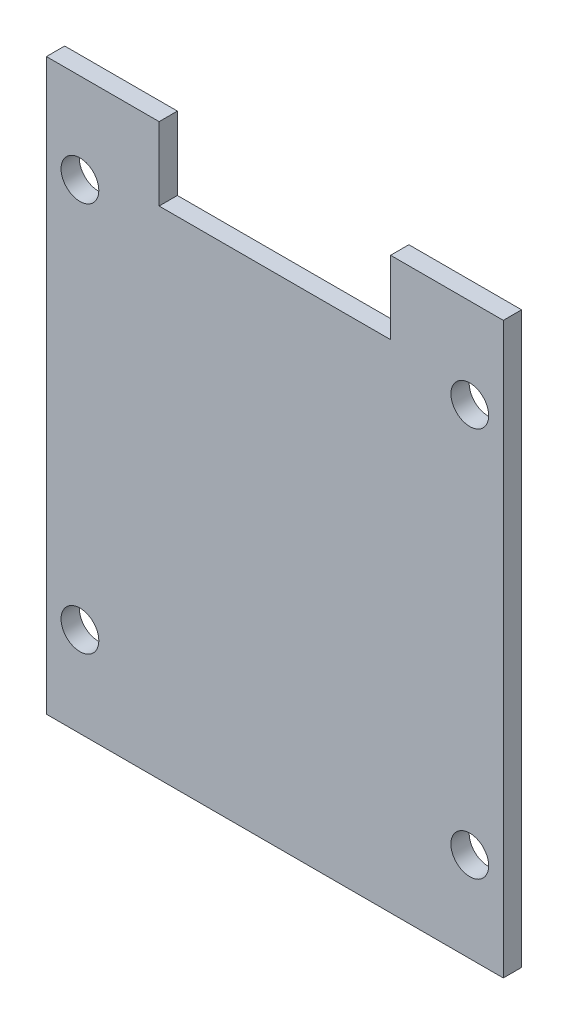
ISO-10303-21;
HEADER;
FILE_DESCRIPTION(('STEP AP214'),'2;1');
FILE_NAME('part.step','',(''),(''),'','','');
FILE_SCHEMA(('AUTOMOTIVE_DESIGN { 1 0 10303 214 1 1 1 1 }'));
ENDSEC;
DATA;
#1=APPLICATION_CONTEXT('core data for automotive mechanical design processes');
#2=APPLICATION_PROTOCOL_DEFINITION('international standard','automotive_design',2000,#1);
#3=PRODUCT_CONTEXT('',#1,'mechanical');
#4=PRODUCT('Part','Part','',(#3));
#5=PRODUCT_RELATED_PRODUCT_CATEGORY('part','',(#4));
#6=PRODUCT_DEFINITION_FORMATION('','',#4);
#7=PRODUCT_DEFINITION_CONTEXT('part definition',#1,'design');
#8=PRODUCT_DEFINITION('design','',#6,#7);
#9=PRODUCT_DEFINITION_SHAPE('','',#8);
#10=(LENGTH_UNIT() NAMED_UNIT(*) SI_UNIT(.MILLI.,.METRE.));
#11=(NAMED_UNIT(*) PLANE_ANGLE_UNIT() SI_UNIT($,.RADIAN.));
#12=(NAMED_UNIT(*) SI_UNIT($,.STERADIAN.) SOLID_ANGLE_UNIT());
#13=UNCERTAINTY_MEASURE_WITH_UNIT(LENGTH_MEASURE(1.E-05),#10,'distance_accuracy_value','');
#14=(GEOMETRIC_REPRESENTATION_CONTEXT(3) GLOBAL_UNCERTAINTY_ASSIGNED_CONTEXT((#13)) GLOBAL_UNIT_ASSIGNED_CONTEXT((#10,
#11,#12)) REPRESENTATION_CONTEXT('',''));
#15=CARTESIAN_POINT('',(0.,0.,0.));
#16=DIRECTION('',(0.,0.,1.));
#17=DIRECTION('',(1.,0.,0.));
#18=AXIS2_PLACEMENT_3D('',#15,#16,#17);
#19=CARTESIAN_POINT('',(-37.5,46.75,3.));
#20=DIRECTION('',(0.,-1.,0.));
#21=DIRECTION('',(0.,0.,-1.));
#22=AXIS2_PLACEMENT_3D('',#19,#20,#21);
#23=PLANE('',#22);
#24=DIRECTION('',(0.,0.,1.));
#25=VECTOR('',#24,1.);
#26=CARTESIAN_POINT('',(19.,46.75,0.));
#27=LINE('',#26,#25);
#28=CARTESIAN_POINT('',(19.,46.75,0.));
#29=VERTEX_POINT('',#28);
#30=CARTESIAN_POINT('',(19.,46.75,3.));
#31=VERTEX_POINT('',#30);
#32=EDGE_CURVE('E114',#29,#31,#27,.T.);
#33=ORIENTED_EDGE('',*,*,#32,.T.);
#34=DIRECTION('',(-1.,0.,0.));
#35=VECTOR('',#34,1.);
#36=CARTESIAN_POINT('',(-37.5,46.75,3.));
#37=LINE('',#36,#35);
#38=CARTESIAN_POINT('',(37.5,46.75,3.));
#39=VERTEX_POINT('',#38);
#40=EDGE_CURVE('E86',#39,#31,#37,.T.);
#41=ORIENTED_EDGE('',*,*,#40,.F.);
#42=DIRECTION('',(0.,0.,-1.));
#43=VECTOR('',#42,1.);
#44=CARTESIAN_POINT('',(37.5,46.75,3.));
#45=LINE('',#44,#43);
#46=CARTESIAN_POINT('',(37.5,46.75,0.));
#47=VERTEX_POINT('',#46);
#48=EDGE_CURVE('E176',#39,#47,#45,.T.);
#49=ORIENTED_EDGE('',*,*,#48,.T.);
#50=DIRECTION('',(-1.,0.,0.));
#51=VECTOR('',#50,1.);
#52=CARTESIAN_POINT('',(-37.5,46.75,0.));
#53=LINE('',#52,#51);
#54=EDGE_CURVE('E165',#47,#29,#53,.T.);
#55=ORIENTED_EDGE('',*,*,#54,.T.);
#56=EDGE_LOOP('',(#33,#41,#49,#55));
#57=FACE_BOUND('',#56,.T.);
#58=ADVANCED_FACE('F33',(#57),#23,.F.);
#59=CARTESIAN_POINT('',(0.,0.,3.));
#60=DIRECTION('',(0.,0.,1.));
#61=DIRECTION('',(1.,0.,0.));
#62=AXIS2_PLACEMENT_3D('',#59,#60,#61);
#63=PLANE('',#62);
#64=CARTESIAN_POINT('',(32.,-32.,3.));
#65=DIRECTION('',(0.,0.,1.));
#66=DIRECTION('',(1.,0.,0.));
#67=AXIS2_PLACEMENT_3D('',#64,#65,#66);
#68=CIRCLE('',#67,3.1);
#69=CARTESIAN_POINT('',(35.1,-32.,3.));
#70=VERTEX_POINT('',#69);
#71=EDGE_CURVE('E11',#70,#70,#68,.T.);
#72=ORIENTED_EDGE('',*,*,#71,.F.);
#73=EDGE_LOOP('',(#72));
#74=FACE_BOUND('',#73,.T.);
#75=CARTESIAN_POINT('',(-32.,-32.,3.));
#76=DIRECTION('',(0.,0.,1.));
#77=DIRECTION('',(1.,0.,0.));
#78=AXIS2_PLACEMENT_3D('',#75,#76,#77);
#79=CIRCLE('',#78,3.1);
#80=CARTESIAN_POINT('',(-28.9,-32.,3.));
#81=VERTEX_POINT('',#80);
#82=EDGE_CURVE('E181',#81,#81,#79,.T.);
#83=ORIENTED_EDGE('',*,*,#82,.F.);
#84=EDGE_LOOP('',(#83));
#85=FACE_BOUND('',#84,.T.);
#86=CARTESIAN_POINT('',(-32.,32.,3.));
#87=DIRECTION('',(0.,0.,1.));
#88=DIRECTION('',(1.,0.,0.));
#89=AXIS2_PLACEMENT_3D('',#86,#87,#88);
#90=CIRCLE('',#89,3.1);
#91=CARTESIAN_POINT('',(-28.9,32.,3.));
#92=VERTEX_POINT('',#91);
#93=EDGE_CURVE('E147',#92,#92,#90,.T.);
#94=ORIENTED_EDGE('',*,*,#93,.F.);
#95=EDGE_LOOP('',(#94));
#96=FACE_BOUND('',#95,.T.);
#97=CARTESIAN_POINT('',(32.,32.,3.));
#98=DIRECTION('',(0.,0.,1.));
#99=DIRECTION('',(1.,0.,0.));
#100=AXIS2_PLACEMENT_3D('',#97,#98,#99);
#101=CIRCLE('',#100,3.1);
#102=CARTESIAN_POINT('',(35.1,32.,3.));
#103=VERTEX_POINT('',#102);
#104=EDGE_CURVE('E144',#103,#103,#101,.T.);
#105=ORIENTED_EDGE('',*,*,#104,.F.);
#106=EDGE_LOOP('',(#105));
#107=FACE_BOUND('',#106,.T.);
#108=ORIENTED_EDGE('',*,*,#40,.T.);
#109=DIRECTION('',(0.,-1.,0.));
#110=VECTOR('',#109,1.);
#111=CARTESIAN_POINT('',(19.,46.75,3.));
#112=LINE('',#111,#110);
#113=CARTESIAN_POINT('',(19.,34.75,3.));
#114=VERTEX_POINT('',#113);
#115=EDGE_CURVE('E134',#31,#114,#112,.T.);
#116=ORIENTED_EDGE('',*,*,#115,.T.);
#117=DIRECTION('',(-1.,0.,0.));
#118=VECTOR('',#117,1.);
#119=CARTESIAN_POINT('',(19.,34.75,3.));
#120=LINE('',#119,#118);
#121=CARTESIAN_POINT('',(-19.,34.75,3.));
#122=VERTEX_POINT('',#121);
#123=EDGE_CURVE('E125',#114,#122,#120,.T.);
#124=ORIENTED_EDGE('',*,*,#123,.T.);
#125=DIRECTION('',(0.,-1.,0.));
#126=VECTOR('',#125,1.);
#127=CARTESIAN_POINT('',(-19.,46.75,3.));
#128=LINE('',#127,#126);
#129=CARTESIAN_POINT('',(-19.,46.75,3.));
#130=VERTEX_POINT('',#129);
#131=EDGE_CURVE('E119',#130,#122,#128,.T.);
#132=ORIENTED_EDGE('',*,*,#131,.F.);
#133=CARTESIAN_POINT('',(-37.5,46.75,3.));
#134=VERTEX_POINT('',#133);
#135=EDGE_CURVE('E156',#130,#134,#37,.T.);
#136=ORIENTED_EDGE('',*,*,#135,.T.);
#137=DIRECTION('',(0.,-1.,0.));
#138=VECTOR('',#137,1.);
#139=CARTESIAN_POINT('',(-37.5,46.75,3.));
#140=LINE('',#139,#138);
#141=CARTESIAN_POINT('',(-37.5,-46.75,3.));
#142=VERTEX_POINT('',#141);
#143=EDGE_CURVE('E158',#134,#142,#140,.T.);
#144=ORIENTED_EDGE('',*,*,#143,.T.);
#145=DIRECTION('',(1.,0.,0.));
#146=VECTOR('',#145,1.);
#147=CARTESIAN_POINT('',(-37.5,-46.75,3.));
#148=LINE('',#147,#146);
#149=CARTESIAN_POINT('',(37.5,-46.75,3.));
#150=VERTEX_POINT('',#149);
#151=EDGE_CURVE('E57',#142,#150,#148,.T.);
#152=ORIENTED_EDGE('',*,*,#151,.T.);
#153=DIRECTION('',(0.,1.,0.));
#154=VECTOR('',#153,1.);
#155=CARTESIAN_POINT('',(37.5,46.75,3.));
#156=LINE('',#155,#154);
#157=EDGE_CURVE('E154',#150,#39,#156,.T.);
#158=ORIENTED_EDGE('',*,*,#157,.T.);
#159=EDGE_LOOP('',(#108,#116,#124,#132,#136,#144,#152,#158));
#160=FACE_BOUND('',#159,.T.);
#161=ADVANCED_FACE('F193',(#74,#85,#96,#107,#160),#63,.T.);
#162=CARTESIAN_POINT('',(0.,0.,0.));
#163=DIRECTION('',(0.,0.,1.));
#164=DIRECTION('',(1.,0.,0.));
#165=AXIS2_PLACEMENT_3D('',#162,#163,#164);
#166=PLANE('',#165);
#167=CARTESIAN_POINT('',(32.,-32.,0.));
#168=DIRECTION('',(0.,0.,1.));
#169=DIRECTION('',(1.,0.,0.));
#170=AXIS2_PLACEMENT_3D('',#167,#168,#169);
#171=CIRCLE('',#170,3.1);
#172=CARTESIAN_POINT('',(35.1,-32.,0.));
#173=VERTEX_POINT('',#172);
#174=EDGE_CURVE('E41',#173,#173,#171,.T.);
#175=ORIENTED_EDGE('',*,*,#174,.T.);
#176=EDGE_LOOP('',(#175));
#177=FACE_BOUND('',#176,.T.);
#178=CARTESIAN_POINT('',(-32.,-32.,0.));
#179=DIRECTION('',(0.,0.,1.));
#180=DIRECTION('',(1.,0.,0.));
#181=AXIS2_PLACEMENT_3D('',#178,#179,#180);
#182=CIRCLE('',#181,3.1);
#183=CARTESIAN_POINT('',(-28.9,-32.,0.));
#184=VERTEX_POINT('',#183);
#185=EDGE_CURVE('E178',#184,#184,#182,.T.);
#186=ORIENTED_EDGE('',*,*,#185,.T.);
#187=EDGE_LOOP('',(#186));
#188=FACE_BOUND('',#187,.T.);
#189=CARTESIAN_POINT('',(-32.,32.,0.));
#190=DIRECTION('',(0.,0.,1.));
#191=DIRECTION('',(1.,0.,0.));
#192=AXIS2_PLACEMENT_3D('',#189,#190,#191);
#193=CIRCLE('',#192,3.1);
#194=CARTESIAN_POINT('',(-28.9,32.,0.));
#195=VERTEX_POINT('',#194);
#196=EDGE_CURVE('E148',#195,#195,#193,.T.);
#197=ORIENTED_EDGE('',*,*,#196,.T.);
#198=EDGE_LOOP('',(#197));
#199=FACE_BOUND('',#198,.T.);
#200=CARTESIAN_POINT('',(32.,32.,0.));
#201=DIRECTION('',(0.,0.,1.));
#202=DIRECTION('',(1.,0.,0.));
#203=AXIS2_PLACEMENT_3D('',#200,#201,#202);
#204=CIRCLE('',#203,3.1);
#205=CARTESIAN_POINT('',(35.1,32.,0.));
#206=VERTEX_POINT('',#205);
#207=EDGE_CURVE('E126',#206,#206,#204,.T.);
#208=ORIENTED_EDGE('',*,*,#207,.T.);
#209=EDGE_LOOP('',(#208));
#210=FACE_BOUND('',#209,.T.);
#211=DIRECTION('',(0.,-1.,0.));
#212=VECTOR('',#211,1.);
#213=CARTESIAN_POINT('',(19.,46.75,0.));
#214=LINE('',#213,#212);
#215=CARTESIAN_POINT('',(19.,34.75,0.));
#216=VERTEX_POINT('',#215);
#217=EDGE_CURVE('E109',#29,#216,#214,.T.);
#218=ORIENTED_EDGE('',*,*,#217,.F.);
#219=ORIENTED_EDGE('',*,*,#54,.F.);
#220=DIRECTION('',(0.,1.,0.));
#221=VECTOR('',#220,1.);
#222=CARTESIAN_POINT('',(37.5,46.75,0.));
#223=LINE('',#222,#221);
#224=CARTESIAN_POINT('',(37.5,-46.75,0.));
#225=VERTEX_POINT('',#224);
#226=EDGE_CURVE('E151',#225,#47,#223,.T.);
#227=ORIENTED_EDGE('',*,*,#226,.F.);
#228=DIRECTION('',(1.,0.,0.));
#229=VECTOR('',#228,1.);
#230=CARTESIAN_POINT('',(-37.5,-46.75,0.));
#231=LINE('',#230,#229);
#232=CARTESIAN_POINT('',(-37.5,-46.75,0.));
#233=VERTEX_POINT('',#232);
#234=EDGE_CURVE('E78',#233,#225,#231,.T.);
#235=ORIENTED_EDGE('',*,*,#234,.F.);
#236=DIRECTION('',(0.,-1.,0.));
#237=VECTOR('',#236,1.);
#238=CARTESIAN_POINT('',(-37.5,46.75,0.));
#239=LINE('',#238,#237);
#240=CARTESIAN_POINT('',(-37.5,46.75,0.));
#241=VERTEX_POINT('',#240);
#242=EDGE_CURVE('E167',#241,#233,#239,.T.);
#243=ORIENTED_EDGE('',*,*,#242,.F.);
#244=CARTESIAN_POINT('',(-19.,46.75,0.));
#245=VERTEX_POINT('',#244);
#246=EDGE_CURVE('E164',#245,#241,#53,.T.);
#247=ORIENTED_EDGE('',*,*,#246,.F.);
#248=DIRECTION('',(0.,-1.,0.));
#249=VECTOR('',#248,1.);
#250=CARTESIAN_POINT('',(-19.,46.75,0.));
#251=LINE('',#250,#249);
#252=CARTESIAN_POINT('',(-19.,34.75,0.));
#253=VERTEX_POINT('',#252);
#254=EDGE_CURVE('E130',#245,#253,#251,.T.);
#255=ORIENTED_EDGE('',*,*,#254,.T.);
#256=DIRECTION('',(-1.,0.,0.));
#257=VECTOR('',#256,1.);
#258=CARTESIAN_POINT('',(19.,34.75,0.));
#259=LINE('',#258,#257);
#260=EDGE_CURVE('E118',#216,#253,#259,.T.);
#261=ORIENTED_EDGE('',*,*,#260,.F.);
#262=EDGE_LOOP('',(#218,#219,#227,#235,#243,#247,#255,#261));
#263=FACE_BOUND('',#262,.T.);
#264=ADVANCED_FACE('F128',(#177,#188,#199,#210,#263),#166,.F.);
#265=CARTESIAN_POINT('',(37.5,46.75,3.));
#266=DIRECTION('',(-1.,0.,0.));
#267=DIRECTION('',(0.,-1.,0.));
#268=AXIS2_PLACEMENT_3D('',#265,#266,#267);
#269=PLANE('',#268);
#270=ORIENTED_EDGE('',*,*,#226,.T.);
#271=ORIENTED_EDGE('',*,*,#48,.F.);
#272=ORIENTED_EDGE('',*,*,#157,.F.);
#273=DIRECTION('',(0.,0.,-1.));
#274=VECTOR('',#273,1.);
#275=CARTESIAN_POINT('',(37.5,-46.75,3.));
#276=LINE('',#275,#274);
#277=EDGE_CURVE('E161',#150,#225,#276,.T.);
#278=ORIENTED_EDGE('',*,*,#277,.T.);
#279=EDGE_LOOP('',(#270,#271,#272,#278));
#280=FACE_BOUND('',#279,.T.);
#281=ADVANCED_FACE('F205',(#280),#269,.F.);
#282=ORIENTED_EDGE('',*,*,#135,.F.);
#283=DIRECTION('',(0.,0.,1.));
#284=VECTOR('',#283,1.);
#285=CARTESIAN_POINT('',(-19.,46.75,0.));
#286=LINE('',#285,#284);
#287=EDGE_CURVE('E139',#245,#130,#286,.T.);
#288=ORIENTED_EDGE('',*,*,#287,.F.);
#289=ORIENTED_EDGE('',*,*,#246,.T.);
#290=DIRECTION('',(0.,0.,-1.));
#291=VECTOR('',#290,1.);
#292=CARTESIAN_POINT('',(-37.5,46.75,3.));
#293=LINE('',#292,#291);
#294=EDGE_CURVE('E173',#134,#241,#293,.T.);
#295=ORIENTED_EDGE('',*,*,#294,.F.);
#296=EDGE_LOOP('',(#282,#288,#289,#295));
#297=FACE_BOUND('',#296,.T.);
#298=ADVANCED_FACE('F224',(#297),#23,.F.);
#299=CARTESIAN_POINT('',(-37.5,46.75,3.));
#300=DIRECTION('',(1.,0.,0.));
#301=DIRECTION('',(0.,1.,0.));
#302=AXIS2_PLACEMENT_3D('',#299,#300,#301);
#303=PLANE('',#302);
#304=ORIENTED_EDGE('',*,*,#242,.T.);
#305=DIRECTION('',(0.,0.,-1.));
#306=VECTOR('',#305,1.);
#307=CARTESIAN_POINT('',(-37.5,-46.75,3.));
#308=LINE('',#307,#306);
#309=EDGE_CURVE('E171',#142,#233,#308,.T.);
#310=ORIENTED_EDGE('',*,*,#309,.F.);
#311=ORIENTED_EDGE('',*,*,#143,.F.);
#312=ORIENTED_EDGE('',*,*,#294,.T.);
#313=EDGE_LOOP('',(#304,#310,#311,#312));
#314=FACE_BOUND('',#313,.T.);
#315=ADVANCED_FACE('F210',(#314),#303,.F.);
#316=CARTESIAN_POINT('',(-37.5,-46.75,3.));
#317=DIRECTION('',(0.,1.,0.));
#318=DIRECTION('',(0.,0.,1.));
#319=AXIS2_PLACEMENT_3D('',#316,#317,#318);
#320=PLANE('',#319);
#321=ORIENTED_EDGE('',*,*,#234,.T.);
#322=ORIENTED_EDGE('',*,*,#277,.F.);
#323=ORIENTED_EDGE('',*,*,#151,.F.);
#324=ORIENTED_EDGE('',*,*,#309,.T.);
#325=EDGE_LOOP('',(#321,#322,#323,#324));
#326=FACE_BOUND('',#325,.T.);
#327=ADVANCED_FACE('F213',(#326),#320,.F.);
#328=CARTESIAN_POINT('',(-32.,32.,0.));
#329=DIRECTION('',(0.,0.,1.));
#330=DIRECTION('',(1.,0.,0.));
#331=AXIS2_PLACEMENT_3D('',#328,#329,#330);
#332=CYLINDRICAL_SURFACE('',#331,3.1);
#333=ORIENTED_EDGE('',*,*,#196,.F.);
#334=EDGE_LOOP('',(#333));
#335=FACE_BOUND('',#334,.T.);
#336=ORIENTED_EDGE('',*,*,#93,.T.);
#337=EDGE_LOOP('',(#336));
#338=FACE_BOUND('',#337,.T.);
#339=ADVANCED_FACE('F215',(#335,#338),#332,.F.);
#340=CARTESIAN_POINT('',(32.,32.,0.));
#341=DIRECTION('',(0.,0.,1.));
#342=DIRECTION('',(1.,0.,0.));
#343=AXIS2_PLACEMENT_3D('',#340,#341,#342);
#344=CYLINDRICAL_SURFACE('',#343,3.1);
#345=ORIENTED_EDGE('',*,*,#207,.F.);
#346=EDGE_LOOP('',(#345));
#347=FACE_BOUND('',#346,.T.);
#348=ORIENTED_EDGE('',*,*,#104,.T.);
#349=EDGE_LOOP('',(#348));
#350=FACE_BOUND('',#349,.T.);
#351=ADVANCED_FACE('F221',(#347,#350),#344,.F.);
#352=CARTESIAN_POINT('',(-32.,-32.,0.));
#353=DIRECTION('',(0.,0.,1.));
#354=DIRECTION('',(1.,0.,0.));
#355=AXIS2_PLACEMENT_3D('',#352,#353,#354);
#356=CYLINDRICAL_SURFACE('',#355,3.1);
#357=ORIENTED_EDGE('',*,*,#185,.F.);
#358=EDGE_LOOP('',(#357));
#359=FACE_BOUND('',#358,.T.);
#360=ORIENTED_EDGE('',*,*,#82,.T.);
#361=EDGE_LOOP('',(#360));
#362=FACE_BOUND('',#361,.T.);
#363=ADVANCED_FACE('F190',(#359,#362),#356,.F.);
#364=CARTESIAN_POINT('',(32.,-32.,0.));
#365=DIRECTION('',(0.,0.,1.));
#366=DIRECTION('',(1.,0.,0.));
#367=AXIS2_PLACEMENT_3D('',#364,#365,#366);
#368=CYLINDRICAL_SURFACE('',#367,3.1);
#369=ORIENTED_EDGE('',*,*,#174,.F.);
#370=EDGE_LOOP('',(#369));
#371=FACE_BOUND('',#370,.T.);
#372=ORIENTED_EDGE('',*,*,#71,.T.);
#373=EDGE_LOOP('',(#372));
#374=FACE_BOUND('',#373,.T.);
#375=ADVANCED_FACE('F35',(#371,#374),#368,.F.);
#376=CARTESIAN_POINT('',(19.,46.75,0.));
#377=DIRECTION('',(-1.,0.,0.));
#378=DIRECTION('',(0.,-1.,0.));
#379=AXIS2_PLACEMENT_3D('',#376,#377,#378);
#380=PLANE('',#379);
#381=ORIENTED_EDGE('',*,*,#115,.F.);
#382=ORIENTED_EDGE('',*,*,#32,.F.);
#383=ORIENTED_EDGE('',*,*,#217,.T.);
#384=DIRECTION('',(0.,0.,1.));
#385=VECTOR('',#384,1.);
#386=CARTESIAN_POINT('',(19.,34.75,0.));
#387=LINE('',#386,#385);
#388=EDGE_CURVE('E112',#216,#114,#387,.T.);
#389=ORIENTED_EDGE('',*,*,#388,.T.);
#390=EDGE_LOOP('',(#381,#382,#383,#389));
#391=FACE_BOUND('',#390,.T.);
#392=ADVANCED_FACE('F111',(#391),#380,.T.);
#393=CARTESIAN_POINT('',(19.,34.75,0.));
#394=DIRECTION('',(0.,1.,0.));
#395=DIRECTION('',(-1.,0.,0.));
#396=AXIS2_PLACEMENT_3D('',#393,#394,#395);
#397=PLANE('',#396);
#398=ORIENTED_EDGE('',*,*,#123,.F.);
#399=ORIENTED_EDGE('',*,*,#388,.F.);
#400=ORIENTED_EDGE('',*,*,#260,.T.);
#401=DIRECTION('',(0.,0.,1.));
#402=VECTOR('',#401,1.);
#403=CARTESIAN_POINT('',(-19.,34.75,0.));
#404=LINE('',#403,#402);
#405=EDGE_CURVE('E48',#253,#122,#404,.T.);
#406=ORIENTED_EDGE('',*,*,#405,.T.);
#407=EDGE_LOOP('',(#398,#399,#400,#406));
#408=FACE_BOUND('',#407,.T.);
#409=ADVANCED_FACE('F122',(#408),#397,.T.);
#410=CARTESIAN_POINT('',(-19.,46.75,0.));
#411=DIRECTION('',(-1.,0.,0.));
#412=DIRECTION('',(0.,-1.,0.));
#413=AXIS2_PLACEMENT_3D('',#410,#411,#412);
#414=PLANE('',#413);
#415=ORIENTED_EDGE('',*,*,#131,.T.);
#416=ORIENTED_EDGE('',*,*,#405,.F.);
#417=ORIENTED_EDGE('',*,*,#254,.F.);
#418=ORIENTED_EDGE('',*,*,#287,.T.);
#419=EDGE_LOOP('',(#415,#416,#417,#418));
#420=FACE_BOUND('',#419,.T.);
#421=ADVANCED_FACE('F240',(#420),#414,.F.);
#422=CLOSED_SHELL('',(#58,#161,#264,#281,#298,#315,#327,#339,#351,#363,#375,#392,#409,#421));
#423=MANIFOLD_SOLID_BREP('B2',#422);
#424=ADVANCED_BREP_SHAPE_REPRESENTATION('',(#18,#423),#14);
#425=SHAPE_DEFINITION_REPRESENTATION(#9,#424);
ENDSEC;
END-ISO-10303-21;
